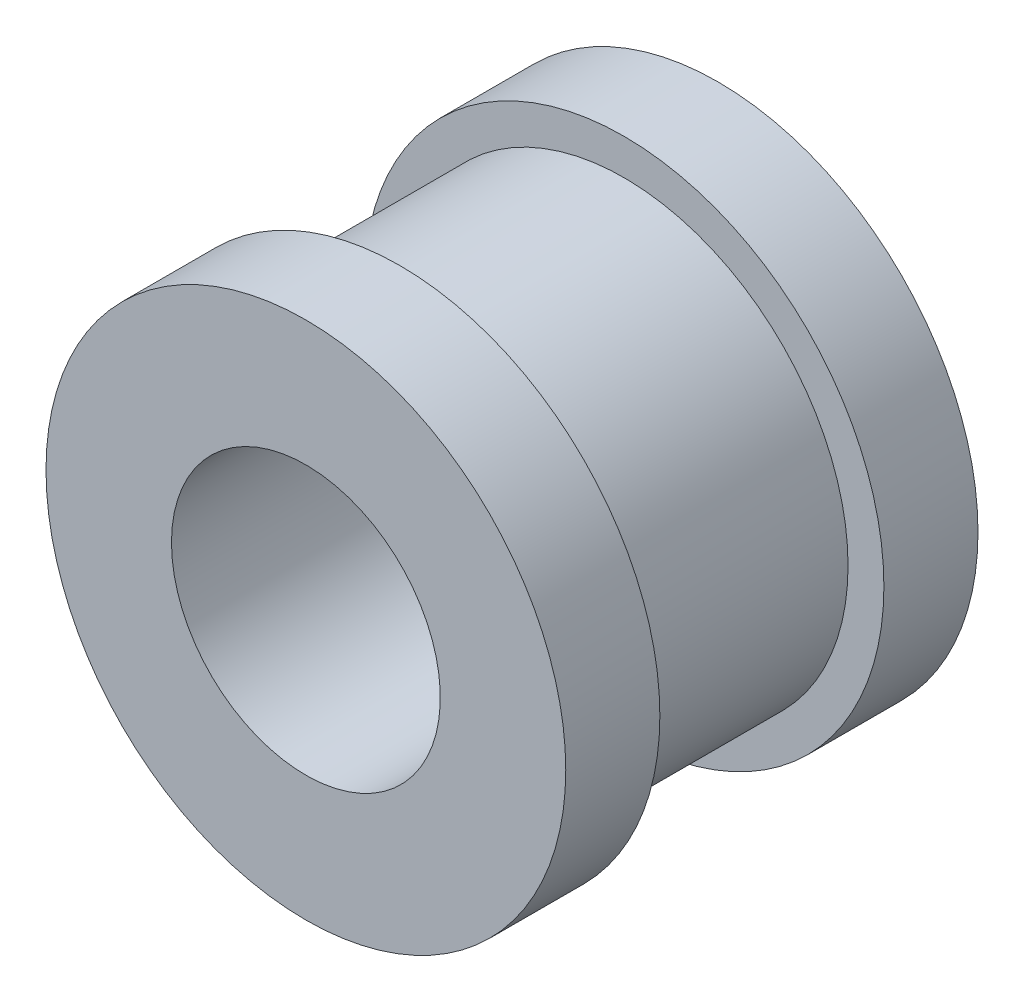
ISO-10303-21;
HEADER;
FILE_DESCRIPTION(('STEP AP214'),'2;1');
FILE_NAME('part.step','',(''),(''),'','','');
FILE_SCHEMA(('AUTOMOTIVE_DESIGN { 1 0 10303 214 1 1 1 1 }'));
ENDSEC;
DATA;
#1=APPLICATION_CONTEXT('core data for automotive mechanical design processes');
#2=APPLICATION_PROTOCOL_DEFINITION('international standard','automotive_design',2000,#1);
#3=PRODUCT_CONTEXT('',#1,'mechanical');
#4=PRODUCT('Part','Part','',(#3));
#5=PRODUCT_RELATED_PRODUCT_CATEGORY('part','',(#4));
#6=PRODUCT_DEFINITION_FORMATION('','',#4);
#7=PRODUCT_DEFINITION_CONTEXT('part definition',#1,'design');
#8=PRODUCT_DEFINITION('design','',#6,#7);
#9=PRODUCT_DEFINITION_SHAPE('','',#8);
#10=(LENGTH_UNIT() NAMED_UNIT(*) SI_UNIT(.MILLI.,.METRE.));
#11=(NAMED_UNIT(*) PLANE_ANGLE_UNIT() SI_UNIT($,.RADIAN.));
#12=(NAMED_UNIT(*) SI_UNIT($,.STERADIAN.) SOLID_ANGLE_UNIT());
#13=UNCERTAINTY_MEASURE_WITH_UNIT(LENGTH_MEASURE(1.E-05),#10,'distance_accuracy_value','');
#14=(GEOMETRIC_REPRESENTATION_CONTEXT(3) GLOBAL_UNCERTAINTY_ASSIGNED_CONTEXT((#13)) GLOBAL_UNIT_ASSIGNED_CONTEXT((#10,
#11,#12)) REPRESENTATION_CONTEXT('',''));
#15=CARTESIAN_POINT('',(0.,0.,0.));
#16=DIRECTION('',(0.,0.,1.));
#17=DIRECTION('',(1.,0.,0.));
#18=AXIS2_PLACEMENT_3D('',#15,#16,#17);
#19=CARTESIAN_POINT('',(0.,0.,1.05));
#20=DIRECTION('',(0.,0.,-1.));
#21=DIRECTION('',(-1.,0.,0.));
#22=AXIS2_PLACEMENT_3D('',#19,#20,#21);
#23=CYLINDRICAL_SURFACE('',#22,2.9);
#24=CARTESIAN_POINT('',(0.,0.,1.05));
#25=DIRECTION('',(0.,0.,1.));
#26=DIRECTION('',(1.,0.,0.));
#27=AXIS2_PLACEMENT_3D('',#24,#25,#26);
#28=CIRCLE('',#27,2.9);
#29=CARTESIAN_POINT('',(2.9,0.,1.05));
#30=VERTEX_POINT('',#29);
#31=EDGE_CURVE('E50',#30,#30,#28,.T.);
#32=ORIENTED_EDGE('',*,*,#31,.F.);
#33=EDGE_LOOP('',(#32));
#34=FACE_BOUND('',#33,.T.);
#35=CARTESIAN_POINT('',(0.,0.,0.));
#36=DIRECTION('',(0.,0.,1.));
#37=DIRECTION('',(1.,0.,0.));
#38=AXIS2_PLACEMENT_3D('',#35,#36,#37);
#39=CIRCLE('',#38,2.9);
#40=CARTESIAN_POINT('',(2.9,0.,0.));
#41=VERTEX_POINT('',#40);
#42=EDGE_CURVE('E45',#41,#41,#39,.T.);
#43=ORIENTED_EDGE('',*,*,#42,.T.);
#44=EDGE_LOOP('',(#43));
#45=FACE_BOUND('',#44,.T.);
#46=ADVANCED_FACE('F42',(#34,#45),#23,.T.);
#47=CARTESIAN_POINT('',(0.,0.,1.05));
#48=DIRECTION('',(0.,0.,1.));
#49=DIRECTION('',(1.,0.,0.));
#50=AXIS2_PLACEMENT_3D('',#47,#48,#49);
#51=PLANE('',#50);
#52=CARTESIAN_POINT('',(0.,0.,1.05));
#53=DIRECTION('',(0.,0.,1.));
#54=DIRECTION('',(1.,0.,0.));
#55=AXIS2_PLACEMENT_3D('',#52,#53,#54);
#56=CIRCLE('',#55,2.5);
#57=CARTESIAN_POINT('',(2.5,0.,1.05));
#58=VERTEX_POINT('',#57);
#59=EDGE_CURVE('E10',#58,#58,#56,.T.);
#60=ORIENTED_EDGE('',*,*,#59,.F.);
#61=EDGE_LOOP('',(#60));
#62=FACE_BOUND('',#61,.T.);
#63=ORIENTED_EDGE('',*,*,#31,.T.);
#64=EDGE_LOOP('',(#63));
#65=FACE_BOUND('',#64,.T.);
#66=ADVANCED_FACE('F84',(#62,#65),#51,.T.);
#67=CARTESIAN_POINT('',(0.,0.,0.));
#68=DIRECTION('',(0.,0.,1.));
#69=DIRECTION('',(1.,0.,0.));
#70=AXIS2_PLACEMENT_3D('',#67,#68,#69);
#71=PLANE('',#70);
#72=CARTESIAN_POINT('',(0.,0.,0.));
#73=DIRECTION('',(0.,0.,-1.));
#74=DIRECTION('',(-1.,0.,0.));
#75=AXIS2_PLACEMENT_3D('',#72,#73,#74);
#76=CIRCLE('',#75,1.5);
#77=CARTESIAN_POINT('',(-1.5,0.,0.));
#78=VERTEX_POINT('',#77);
#79=EDGE_CURVE('E73',#78,#78,#76,.T.);
#80=ORIENTED_EDGE('',*,*,#79,.F.);
#81=EDGE_LOOP('',(#80));
#82=FACE_BOUND('',#81,.T.);
#83=ORIENTED_EDGE('',*,*,#42,.F.);
#84=EDGE_LOOP('',(#83));
#85=FACE_BOUND('',#84,.T.);
#86=ADVANCED_FACE('F80',(#82,#85),#71,.F.);
#87=CARTESIAN_POINT('',(0.,0.,3.55));
#88=DIRECTION('',(0.,0.,-1.));
#89=DIRECTION('',(-1.,0.,0.));
#90=AXIS2_PLACEMENT_3D('',#87,#88,#89);
#91=CYLINDRICAL_SURFACE('',#90,2.5);
#92=CARTESIAN_POINT('',(0.,0.,3.55));
#93=DIRECTION('',(0.,0.,1.));
#94=DIRECTION('',(1.,0.,0.));
#95=AXIS2_PLACEMENT_3D('',#92,#93,#94);
#96=CIRCLE('',#95,2.5);
#97=CARTESIAN_POINT('',(2.5,0.,3.55));
#98=VERTEX_POINT('',#97);
#99=EDGE_CURVE('E57',#98,#98,#96,.T.);
#100=ORIENTED_EDGE('',*,*,#99,.F.);
#101=EDGE_LOOP('',(#100));
#102=FACE_BOUND('',#101,.T.);
#103=ORIENTED_EDGE('',*,*,#59,.T.);
#104=EDGE_LOOP('',(#103));
#105=FACE_BOUND('',#104,.T.);
#106=ADVANCED_FACE('F83',(#102,#105),#91,.T.);
#107=CARTESIAN_POINT('',(0.,0.,3.55));
#108=DIRECTION('',(0.,0.,1.));
#109=DIRECTION('',(1.,0.,0.));
#110=AXIS2_PLACEMENT_3D('',#107,#108,#109);
#111=CYLINDRICAL_SURFACE('',#110,2.9);
#112=CARTESIAN_POINT('',(0.,0.,3.55));
#113=DIRECTION('',(0.,0.,1.));
#114=DIRECTION('',(1.,0.,0.));
#115=AXIS2_PLACEMENT_3D('',#112,#113,#114);
#116=CIRCLE('',#115,2.9);
#117=CARTESIAN_POINT('',(2.9,0.,3.55));
#118=VERTEX_POINT('',#117);
#119=EDGE_CURVE('E61',#118,#118,#116,.T.);
#120=ORIENTED_EDGE('',*,*,#119,.T.);
#121=EDGE_LOOP('',(#120));
#122=FACE_BOUND('',#121,.T.);
#123=CARTESIAN_POINT('',(0.,0.,4.6));
#124=DIRECTION('',(0.,0.,1.));
#125=DIRECTION('',(1.,0.,0.));
#126=AXIS2_PLACEMENT_3D('',#123,#124,#125);
#127=CIRCLE('',#126,2.9);
#128=CARTESIAN_POINT('',(2.9,0.,4.6));
#129=VERTEX_POINT('',#128);
#130=EDGE_CURVE('E62',#129,#129,#127,.T.);
#131=ORIENTED_EDGE('',*,*,#130,.F.);
#132=EDGE_LOOP('',(#131));
#133=FACE_BOUND('',#132,.T.);
#134=ADVANCED_FACE('F103',(#122,#133),#111,.T.);
#135=CARTESIAN_POINT('',(0.,0.,3.55));
#136=DIRECTION('',(0.,0.,-1.));
#137=DIRECTION('',(1.,0.,0.));
#138=AXIS2_PLACEMENT_3D('',#135,#136,#137);
#139=PLANE('',#138);
#140=ORIENTED_EDGE('',*,*,#99,.T.);
#141=EDGE_LOOP('',(#140));
#142=FACE_BOUND('',#141,.T.);
#143=ORIENTED_EDGE('',*,*,#119,.F.);
#144=EDGE_LOOP('',(#143));
#145=FACE_BOUND('',#144,.T.);
#146=ADVANCED_FACE('F107',(#142,#145),#139,.T.);
#147=CARTESIAN_POINT('',(0.,0.,4.6));
#148=DIRECTION('',(0.,0.,-1.));
#149=DIRECTION('',(1.,0.,0.));
#150=AXIS2_PLACEMENT_3D('',#147,#148,#149);
#151=PLANE('',#150);
#152=CARTESIAN_POINT('',(0.,0.,4.6));
#153=DIRECTION('',(0.,0.,-1.));
#154=DIRECTION('',(-1.,0.,0.));
#155=AXIS2_PLACEMENT_3D('',#152,#153,#154);
#156=CIRCLE('',#155,1.5);
#157=CARTESIAN_POINT('',(-1.5,0.,4.6));
#158=VERTEX_POINT('',#157);
#159=EDGE_CURVE('E66',#158,#158,#156,.F.);
#160=ORIENTED_EDGE('',*,*,#159,.F.);
#161=EDGE_LOOP('',(#160));
#162=FACE_BOUND('',#161,.T.);
#163=ORIENTED_EDGE('',*,*,#130,.T.);
#164=EDGE_LOOP('',(#163));
#165=FACE_BOUND('',#164,.T.);
#166=ADVANCED_FACE('F109',(#162,#165),#151,.F.);
#167=CARTESIAN_POINT('',(0.,0.,8.84264068711929));
#168=DIRECTION('',(0.,0.,-1.));
#169=DIRECTION('',(-1.,0.,0.));
#170=AXIS2_PLACEMENT_3D('',#167,#168,#169);
#171=CYLINDRICAL_SURFACE('',#170,1.5);
#172=ORIENTED_EDGE('',*,*,#159,.T.);
#173=EDGE_LOOP('',(#172));
#174=FACE_BOUND('',#173,.T.);
#175=ORIENTED_EDGE('',*,*,#79,.T.);
#176=EDGE_LOOP('',(#175));
#177=FACE_BOUND('',#176,.T.);
#178=ADVANCED_FACE('F78',(#174,#177),#171,.F.);
#179=CLOSED_SHELL('',(#46,#66,#86,#106,#134,#146,#166,#178));
#180=MANIFOLD_SOLID_BREP('B2',#179);
#181=ADVANCED_BREP_SHAPE_REPRESENTATION('',(#18,#180),#14);
#182=SHAPE_DEFINITION_REPRESENTATION(#9,#181);
ENDSEC;
END-ISO-10303-21;
